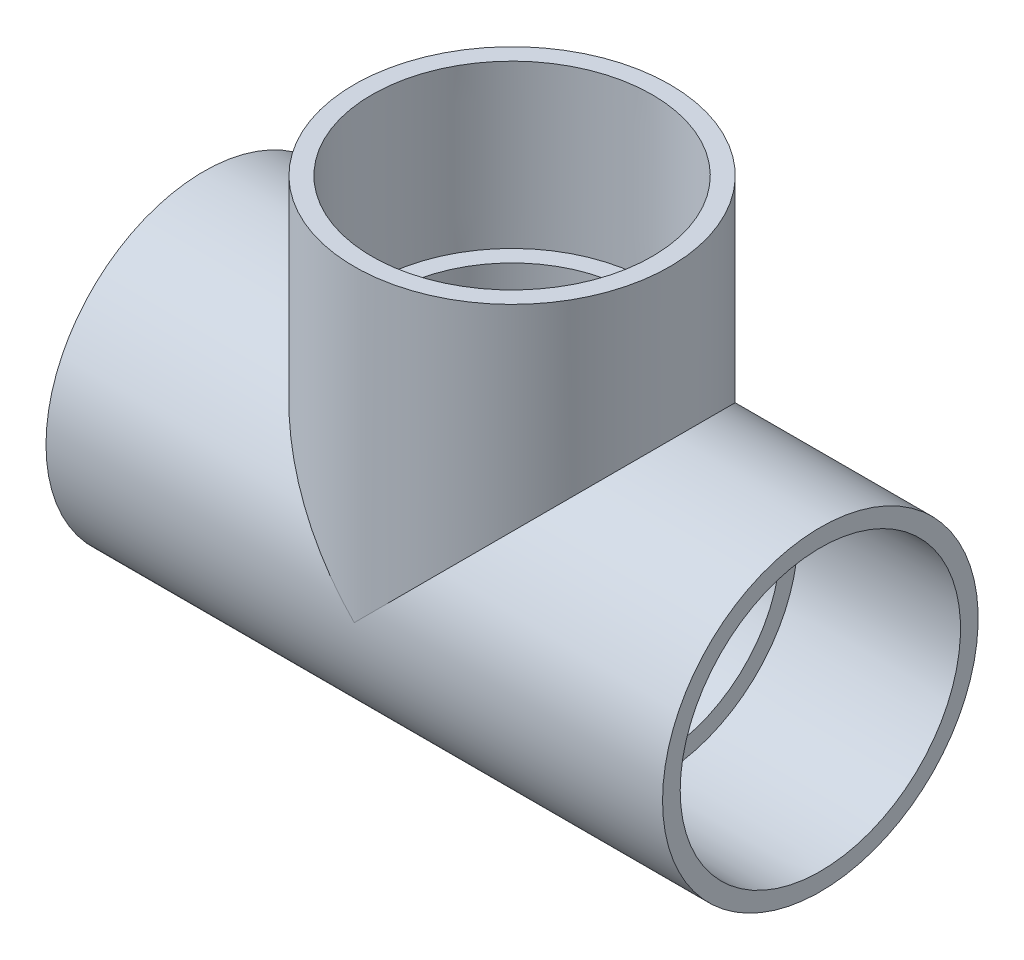
ISO-10303-21;
HEADER;
FILE_DESCRIPTION(('STEP AP214'),'2;1');
FILE_NAME('part.step','',(''),(''),'','','');
FILE_SCHEMA(('AUTOMOTIVE_DESIGN { 1 0 10303 214 1 1 1 1 }'));
ENDSEC;
DATA;
#1=APPLICATION_CONTEXT('core data for automotive mechanical design processes');
#2=APPLICATION_PROTOCOL_DEFINITION('international standard','automotive_design',2000,#1);
#3=PRODUCT_CONTEXT('',#1,'mechanical');
#4=PRODUCT('Part','Part','',(#3));
#5=PRODUCT_RELATED_PRODUCT_CATEGORY('part','',(#4));
#6=PRODUCT_DEFINITION_FORMATION('','',#4);
#7=PRODUCT_DEFINITION_CONTEXT('part definition',#1,'design');
#8=PRODUCT_DEFINITION('design','',#6,#7);
#9=PRODUCT_DEFINITION_SHAPE('','',#8);
#10=(LENGTH_UNIT() NAMED_UNIT(*) SI_UNIT(.MILLI.,.METRE.));
#11=(NAMED_UNIT(*) PLANE_ANGLE_UNIT() SI_UNIT($,.RADIAN.));
#12=(NAMED_UNIT(*) SI_UNIT($,.STERADIAN.) SOLID_ANGLE_UNIT());
#13=UNCERTAINTY_MEASURE_WITH_UNIT(LENGTH_MEASURE(1.E-05),#10,'distance_accuracy_value','');
#14=(GEOMETRIC_REPRESENTATION_CONTEXT(3) GLOBAL_UNCERTAINTY_ASSIGNED_CONTEXT((#13)) GLOBAL_UNIT_ASSIGNED_CONTEXT((#10,
#11,#12)) REPRESENTATION_CONTEXT('',''));
#15=CARTESIAN_POINT('',(0.,0.,0.));
#16=DIRECTION('',(0.,0.,1.));
#17=DIRECTION('',(1.,0.,0.));
#18=AXIS2_PLACEMENT_3D('',#15,#16,#17);
#19=CARTESIAN_POINT('',(-66.675,0.,0.));
#20=DIRECTION('',(-1.,0.,0.));
#21=DIRECTION('',(0.,0.,1.));
#22=AXIS2_PLACEMENT_3D('',#19,#20,#21);
#23=CYLINDRICAL_SURFACE('',#22,34.13125);
#24=CARTESIAN_POINT('',(-66.675,0.,0.));
#25=DIRECTION('',(-1.,0.,0.));
#26=DIRECTION('',(0.,0.,1.));
#27=AXIS2_PLACEMENT_3D('',#24,#25,#26);
#28=CIRCLE('',#27,34.13125);
#29=CARTESIAN_POINT('',(-66.675,0.,34.13125));
#30=VERTEX_POINT('',#29);
#31=EDGE_CURVE('E105',#30,#30,#28,.T.);
#32=ORIENTED_EDGE('',*,*,#31,.F.);
#33=EDGE_LOOP('',(#32));
#34=FACE_BOUND('',#33,.T.);
#35=CARTESIAN_POINT('',(66.675,0.,0.));
#36=DIRECTION('',(-1.,0.,0.));
#37=DIRECTION('',(0.,0.,1.));
#38=AXIS2_PLACEMENT_3D('',#35,#36,#37);
#39=CIRCLE('',#38,34.13125);
#40=CARTESIAN_POINT('',(66.675,0.,34.13125));
#41=VERTEX_POINT('',#40);
#42=EDGE_CURVE('E83',#41,#41,#39,.T.);
#43=ORIENTED_EDGE('',*,*,#42,.T.);
#44=EDGE_LOOP('',(#43));
#45=FACE_BOUND('',#44,.T.);
#46=CARTESIAN_POINT('',(0.,0.,0.));
#47=DIRECTION('',(-0.707106781186547,-0.707106781186547,0.));
#48=DIRECTION('',(-0.707106781186547,0.707106781186547,0.));
#49=AXIS2_PLACEMENT_3D('',#46,#47,#48);
#50=ELLIPSE('',#49,48.2688766507467,34.13125);
#51=CARTESIAN_POINT('',(0.,0.,-34.13125));
#52=VERTEX_POINT('',#51);
#53=CARTESIAN_POINT('',(0.,0.,34.13125));
#54=VERTEX_POINT('',#53);
#55=EDGE_CURVE('E60',#52,#54,#50,.F.);
#56=ORIENTED_EDGE('',*,*,#55,.F.);
#57=CARTESIAN_POINT('',(0.,0.,0.));
#58=DIRECTION('',(0.707106781186547,-0.707106781186547,0.));
#59=DIRECTION('',(-0.707106781186547,-0.707106781186547,0.));
#60=AXIS2_PLACEMENT_3D('',#57,#58,#59);
#61=ELLIPSE('',#60,48.2688766507467,34.13125);
#62=EDGE_CURVE('E96',#52,#54,#61,.T.);
#63=ORIENTED_EDGE('',*,*,#62,.T.);
#64=EDGE_LOOP('',(#56,#63));
#65=FACE_BOUND('',#64,.T.);
#66=ADVANCED_FACE('F41',(#34,#45,#65),#23,.T.);
#67=CARTESIAN_POINT('',(-66.675,-34.13125,0.));
#68=DIRECTION('',(-1.,0.,0.));
#69=DIRECTION('',(0.,0.,1.));
#70=AXIS2_PLACEMENT_3D('',#67,#68,#69);
#71=PLANE('',#70);
#72=ORIENTED_EDGE('',*,*,#31,.T.);
#73=EDGE_LOOP('',(#72));
#74=FACE_BOUND('',#73,.T.);
#75=CARTESIAN_POINT('',(-66.675,0.,0.));
#76=DIRECTION('',(-1.,0.,0.));
#77=DIRECTION('',(0.,0.,1.));
#78=AXIS2_PLACEMENT_3D('',#75,#76,#77);
#79=CIRCLE('',#78,30.3149);
#80=CARTESIAN_POINT('',(-66.675,0.,30.3149));
#81=VERTEX_POINT('',#80);
#82=EDGE_CURVE('E113',#81,#81,#79,.T.);
#83=ORIENTED_EDGE('',*,*,#82,.F.);
#84=EDGE_LOOP('',(#83));
#85=FACE_BOUND('',#84,.T.);
#86=ADVANCED_FACE('F43',(#74,#85),#71,.T.);
#87=CARTESIAN_POINT('',(-31.75,0.,0.));
#88=DIRECTION('',(-1.,0.,0.));
#89=DIRECTION('',(0.,0.,1.));
#90=AXIS2_PLACEMENT_3D('',#87,#88,#89);
#91=CONICAL_SURFACE('',#90,30.0863,0.00654536107227494);
#92=ORIENTED_EDGE('',*,*,#82,.T.);
#93=EDGE_LOOP('',(#92));
#94=FACE_BOUND('',#93,.T.);
#95=CARTESIAN_POINT('',(-31.75,0.,0.));
#96=DIRECTION('',(-1.,0.,0.));
#97=DIRECTION('',(0.,0.,1.));
#98=AXIS2_PLACEMENT_3D('',#95,#96,#97);
#99=CIRCLE('',#98,30.0863);
#100=CARTESIAN_POINT('',(-31.75,0.,30.0863));
#101=VERTEX_POINT('',#100);
#102=EDGE_CURVE('E110',#101,#101,#99,.T.);
#103=ORIENTED_EDGE('',*,*,#102,.F.);
#104=EDGE_LOOP('',(#103));
#105=FACE_BOUND('',#104,.T.);
#106=ADVANCED_FACE('F147',(#94,#105),#91,.F.);
#107=CARTESIAN_POINT('',(126.618899054498,31.75,-12.5251637339597));
#108=DIRECTION('',(0.,-1.,0.));
#109=DIRECTION('',(0.,0.,-1.));
#110=AXIS2_PLACEMENT_3D('',#107,#108,#109);
#111=PLANE('',#110);
#112=CARTESIAN_POINT('',(0.,31.75,0.));
#113=DIRECTION('',(0.,1.,0.));
#114=DIRECTION('',(0.,0.,1.));
#115=AXIS2_PLACEMENT_3D('',#112,#113,#114);
#116=CIRCLE('',#115,26.2509);
#117=CARTESIAN_POINT('',(0.,31.75,26.2509));
#118=VERTEX_POINT('',#117);
#119=EDGE_CURVE('E81',#118,#118,#116,.T.);
#120=ORIENTED_EDGE('',*,*,#119,.F.);
#121=EDGE_LOOP('',(#120));
#122=FACE_BOUND('',#121,.T.);
#123=CARTESIAN_POINT('',(0.,31.75,0.));
#124=DIRECTION('',(0.,-1.,0.));
#125=DIRECTION('',(0.,0.,-1.));
#126=AXIS2_PLACEMENT_3D('',#123,#124,#125);
#127=CIRCLE('',#126,30.0863);
#128=CARTESIAN_POINT('',(0.,31.75,-30.0863));
#129=VERTEX_POINT('',#128);
#130=EDGE_CURVE('E67',#129,#129,#127,.F.);
#131=ORIENTED_EDGE('',*,*,#130,.T.);
#132=EDGE_LOOP('',(#131));
#133=FACE_BOUND('',#132,.T.);
#134=ADVANCED_FACE('F119',(#122,#133),#111,.F.);
#135=CARTESIAN_POINT('',(-31.75,0.,0.));
#136=DIRECTION('',(1.,0.,0.));
#137=DIRECTION('',(0.,0.,-1.));
#138=AXIS2_PLACEMENT_3D('',#135,#136,#137);
#139=PLANE('',#138);
#140=CARTESIAN_POINT('',(-31.75,0.,0.));
#141=DIRECTION('',(-1.,0.,0.));
#142=DIRECTION('',(0.,0.,1.));
#143=AXIS2_PLACEMENT_3D('',#140,#141,#142);
#144=CIRCLE('',#143,26.2509);
#145=CARTESIAN_POINT('',(-31.75,0.,26.2509));
#146=VERTEX_POINT('',#145);
#147=EDGE_CURVE('E79',#146,#146,#144,.T.);
#148=ORIENTED_EDGE('',*,*,#147,.F.);
#149=EDGE_LOOP('',(#148));
#150=FACE_BOUND('',#149,.T.);
#151=ORIENTED_EDGE('',*,*,#102,.T.);
#152=EDGE_LOOP('',(#151));
#153=FACE_BOUND('',#152,.T.);
#154=ADVANCED_FACE('F132',(#150,#153),#139,.F.);
#155=CARTESIAN_POINT('',(34.13125,66.675,0.));
#156=DIRECTION('',(0.,1.,0.));
#157=DIRECTION('',(0.,0.,1.));
#158=AXIS2_PLACEMENT_3D('',#155,#156,#157);
#159=PLANE('',#158);
#160=CARTESIAN_POINT('',(0.,66.675,0.));
#161=DIRECTION('',(0.,-1.,0.));
#162=DIRECTION('',(0.,0.,-1.));
#163=AXIS2_PLACEMENT_3D('',#160,#161,#162);
#164=CIRCLE('',#163,30.3149);
#165=CARTESIAN_POINT('',(0.,66.675,-30.3149));
#166=VERTEX_POINT('',#165);
#167=EDGE_CURVE('E98',#166,#166,#164,.T.);
#168=ORIENTED_EDGE('',*,*,#167,.T.);
#169=EDGE_LOOP('',(#168));
#170=FACE_BOUND('',#169,.T.);
#171=CARTESIAN_POINT('',(0.,66.675,0.));
#172=DIRECTION('',(0.,-1.,0.));
#173=DIRECTION('',(0.,0.,-1.));
#174=AXIS2_PLACEMENT_3D('',#171,#172,#173);
#175=CIRCLE('',#174,34.13125);
#176=CARTESIAN_POINT('',(0.,66.675,-34.13125));
#177=VERTEX_POINT('',#176);
#178=EDGE_CURVE('E101',#177,#177,#175,.T.);
#179=ORIENTED_EDGE('',*,*,#178,.F.);
#180=EDGE_LOOP('',(#179));
#181=FACE_BOUND('',#180,.T.);
#182=ADVANCED_FACE('F129',(#170,#181),#159,.T.);
#183=CARTESIAN_POINT('',(0.,0.,0.));
#184=DIRECTION('',(0.,-1.,0.));
#185=DIRECTION('',(0.,0.,-1.));
#186=AXIS2_PLACEMENT_3D('',#183,#184,#185);
#187=CYLINDRICAL_SURFACE('',#186,34.13125);
#188=ORIENTED_EDGE('',*,*,#62,.F.);
#189=ORIENTED_EDGE('',*,*,#55,.T.);
#190=EDGE_LOOP('',(#188,#189));
#191=FACE_BOUND('',#190,.T.);
#192=ORIENTED_EDGE('',*,*,#178,.T.);
#193=EDGE_LOOP('',(#192));
#194=FACE_BOUND('',#193,.T.);
#195=ADVANCED_FACE('F125',(#191,#194),#187,.T.);
#196=CARTESIAN_POINT('',(0.,66.675,0.));
#197=DIRECTION('',(0.,1.,0.));
#198=DIRECTION('',(0.,0.,1.));
#199=AXIS2_PLACEMENT_3D('',#196,#197,#198);
#200=CONICAL_SURFACE('',#199,30.3149,0.00654536107227494);
#201=ORIENTED_EDGE('',*,*,#130,.F.);
#202=EDGE_LOOP('',(#201));
#203=FACE_BOUND('',#202,.T.);
#204=ORIENTED_EDGE('',*,*,#167,.F.);
#205=EDGE_LOOP('',(#204));
#206=FACE_BOUND('',#205,.T.);
#207=ADVANCED_FACE('F121',(#203,#206),#200,.F.);
#208=CARTESIAN_POINT('',(66.675,-34.13125,0.));
#209=DIRECTION('',(1.,0.,0.));
#210=DIRECTION('',(0.,0.,1.));
#211=AXIS2_PLACEMENT_3D('',#208,#209,#210);
#212=PLANE('',#211);
#213=ORIENTED_EDGE('',*,*,#42,.F.);
#214=EDGE_LOOP('',(#213));
#215=FACE_BOUND('',#214,.T.);
#216=CARTESIAN_POINT('',(66.675,0.,0.));
#217=DIRECTION('',(-1.,0.,0.));
#218=DIRECTION('',(0.,0.,1.));
#219=AXIS2_PLACEMENT_3D('',#216,#217,#218);
#220=CIRCLE('',#219,30.3149);
#221=CARTESIAN_POINT('',(66.675,0.,30.3149));
#222=VERTEX_POINT('',#221);
#223=EDGE_CURVE('E93',#222,#222,#220,.T.);
#224=ORIENTED_EDGE('',*,*,#223,.T.);
#225=EDGE_LOOP('',(#224));
#226=FACE_BOUND('',#225,.T.);
#227=ADVANCED_FACE('F124',(#215,#226),#212,.T.);
#228=CARTESIAN_POINT('',(31.75,0.,0.));
#229=DIRECTION('',(1.,0.,0.));
#230=DIRECTION('',(0.,0.,1.));
#231=AXIS2_PLACEMENT_3D('',#228,#229,#230);
#232=CONICAL_SURFACE('',#231,30.0863,0.00654536107227494);
#233=ORIENTED_EDGE('',*,*,#223,.F.);
#234=EDGE_LOOP('',(#233));
#235=FACE_BOUND('',#234,.T.);
#236=CARTESIAN_POINT('',(31.75,0.,0.));
#237=DIRECTION('',(-1.,0.,0.));
#238=DIRECTION('',(0.,0.,1.));
#239=AXIS2_PLACEMENT_3D('',#236,#237,#238);
#240=CIRCLE('',#239,30.0863);
#241=CARTESIAN_POINT('',(31.75,0.,30.0863));
#242=VERTEX_POINT('',#241);
#243=EDGE_CURVE('E90',#242,#242,#240,.T.);
#244=ORIENTED_EDGE('',*,*,#243,.T.);
#245=EDGE_LOOP('',(#244));
#246=FACE_BOUND('',#245,.T.);
#247=ADVANCED_FACE('F168',(#235,#246),#232,.F.);
#248=CARTESIAN_POINT('',(31.75,-34.13125,0.));
#249=DIRECTION('',(-1.,0.,0.));
#250=DIRECTION('',(0.,0.,-1.));
#251=AXIS2_PLACEMENT_3D('',#248,#249,#250);
#252=PLANE('',#251);
#253=CARTESIAN_POINT('',(31.75,0.,0.));
#254=DIRECTION('',(-1.,0.,0.));
#255=DIRECTION('',(0.,0.,1.));
#256=AXIS2_PLACEMENT_3D('',#253,#254,#255);
#257=CIRCLE('',#256,26.2509);
#258=CARTESIAN_POINT('',(31.75,0.,26.2509));
#259=VERTEX_POINT('',#258);
#260=EDGE_CURVE('E76',#259,#259,#257,.F.);
#261=ORIENTED_EDGE('',*,*,#260,.F.);
#262=EDGE_LOOP('',(#261));
#263=FACE_BOUND('',#262,.T.);
#264=ORIENTED_EDGE('',*,*,#243,.F.);
#265=EDGE_LOOP('',(#264));
#266=FACE_BOUND('',#265,.T.);
#267=ADVANCED_FACE('F71',(#263,#266),#252,.F.);
#268=CARTESIAN_POINT('',(105.998757609,0.,0.));
#269=DIRECTION('',(-1.,0.,0.));
#270=DIRECTION('',(0.,0.,1.));
#271=AXIS2_PLACEMENT_3D('',#268,#269,#270);
#272=CYLINDRICAL_SURFACE('',#271,26.2509);
#273=CARTESIAN_POINT('',(0.,0.,0.));
#274=DIRECTION('',(-0.707106781186547,-0.707106781186547,0.));
#275=DIRECTION('',(-0.707106781186547,0.707106781186547,0.));
#276=AXIS2_PLACEMENT_3D('',#273,#274,#275);
#277=ELLIPSE('',#276,37.1243788044999,26.2509);
#278=CARTESIAN_POINT('',(0.,0.,-26.2509));
#279=VERTEX_POINT('',#278);
#280=CARTESIAN_POINT('',(0.,0.,26.2509));
#281=VERTEX_POINT('',#280);
#282=EDGE_CURVE('E49',#279,#281,#277,.F.);
#283=ORIENTED_EDGE('',*,*,#282,.T.);
#284=CARTESIAN_POINT('',(0.,0.,0.));
#285=DIRECTION('',(-0.707106781186547,0.707106781186547,0.));
#286=DIRECTION('',(-0.707106781186547,-0.707106781186547,0.));
#287=AXIS2_PLACEMENT_3D('',#284,#285,#286);
#288=ELLIPSE('',#287,37.1243788044999,26.2509);
#289=EDGE_CURVE('E11',#281,#279,#288,.T.);
#290=ORIENTED_EDGE('',*,*,#289,.T.);
#291=EDGE_LOOP('',(#283,#290));
#292=FACE_BOUND('',#291,.T.);
#293=ORIENTED_EDGE('',*,*,#260,.T.);
#294=EDGE_LOOP('',(#293));
#295=FACE_BOUND('',#294,.T.);
#296=ORIENTED_EDGE('',*,*,#147,.T.);
#297=EDGE_LOOP('',(#296));
#298=FACE_BOUND('',#297,.T.);
#299=ADVANCED_FACE('F68',(#292,#295,#298),#272,.F.);
#300=CARTESIAN_POINT('',(0.,0.,0.));
#301=DIRECTION('',(0.,1.,0.));
#302=DIRECTION('',(0.,0.,1.));
#303=AXIS2_PLACEMENT_3D('',#300,#301,#302);
#304=CYLINDRICAL_SURFACE('',#303,26.2509);
#305=ORIENTED_EDGE('',*,*,#119,.T.);
#306=EDGE_LOOP('',(#305));
#307=FACE_BOUND('',#306,.T.);
#308=ORIENTED_EDGE('',*,*,#282,.F.);
#309=ORIENTED_EDGE('',*,*,#289,.F.);
#310=EDGE_LOOP('',(#308,#309));
#311=FACE_BOUND('',#310,.T.);
#312=ADVANCED_FACE('F65',(#307,#311),#304,.F.);
#313=CLOSED_SHELL('',(#66,#86,#106,#134,#154,#182,#195,#207,#227,#247,#267,#299,#312));
#314=MANIFOLD_SOLID_BREP('B2',#313);
#315=ADVANCED_BREP_SHAPE_REPRESENTATION('',(#18,#314),#14);
#316=SHAPE_DEFINITION_REPRESENTATION(#9,#315);
ENDSEC;
END-ISO-10303-21;
